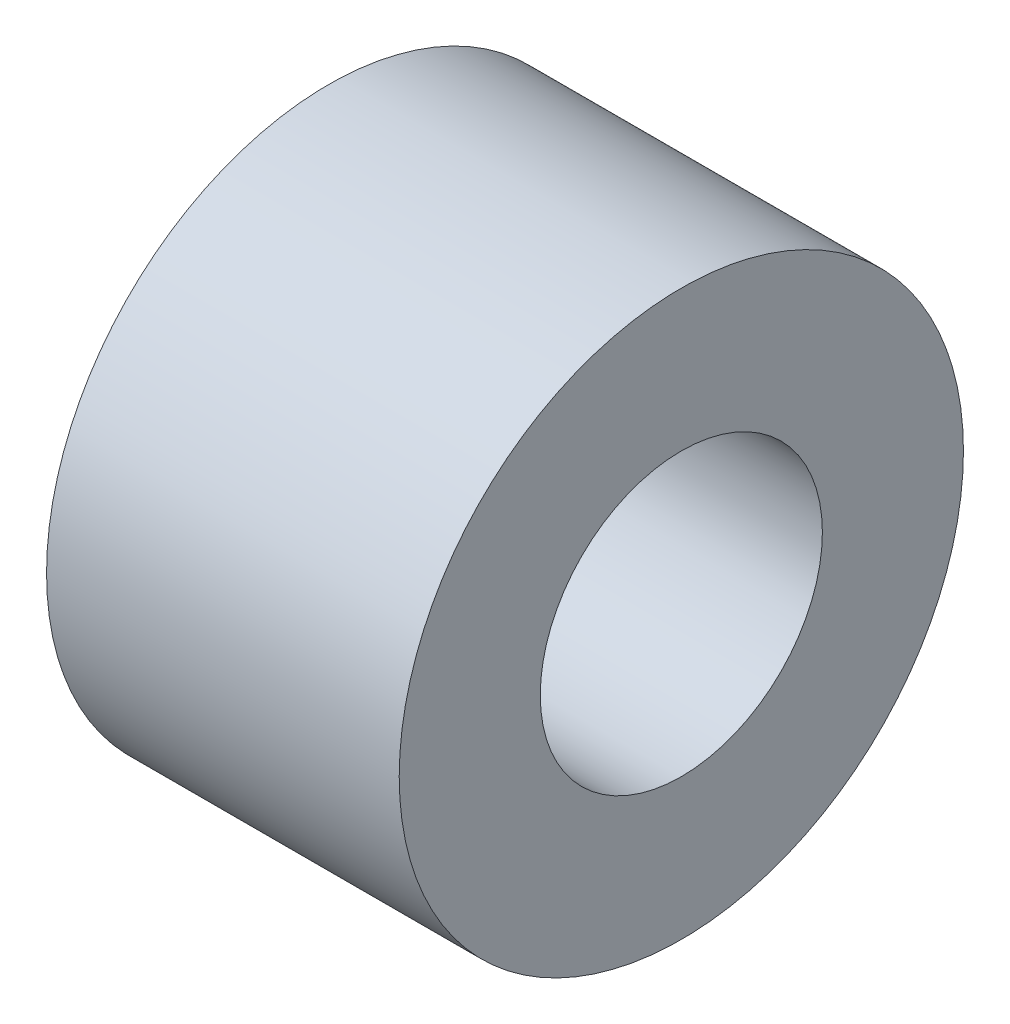
ISO-10303-21;
HEADER;
FILE_DESCRIPTION(('STEP AP214'),'2;1');
FILE_NAME('part.step','',(''),(''),'','','');
FILE_SCHEMA(('AUTOMOTIVE_DESIGN { 1 0 10303 214 1 1 1 1 }'));
ENDSEC;
DATA;
#1=APPLICATION_CONTEXT('core data for automotive mechanical design processes');
#2=APPLICATION_PROTOCOL_DEFINITION('international standard','automotive_design',2000,#1);
#3=PRODUCT_CONTEXT('',#1,'mechanical');
#4=PRODUCT('Part','Part','',(#3));
#5=PRODUCT_RELATED_PRODUCT_CATEGORY('part','',(#4));
#6=PRODUCT_DEFINITION_FORMATION('','',#4);
#7=PRODUCT_DEFINITION_CONTEXT('part definition',#1,'design');
#8=PRODUCT_DEFINITION('design','',#6,#7);
#9=PRODUCT_DEFINITION_SHAPE('','',#8);
#10=(LENGTH_UNIT() NAMED_UNIT(*) SI_UNIT(.MILLI.,.METRE.));
#11=(NAMED_UNIT(*) PLANE_ANGLE_UNIT() SI_UNIT($,.RADIAN.));
#12=(NAMED_UNIT(*) SI_UNIT($,.STERADIAN.) SOLID_ANGLE_UNIT());
#13=UNCERTAINTY_MEASURE_WITH_UNIT(LENGTH_MEASURE(1.E-05),#10,'distance_accuracy_value','');
#14=(GEOMETRIC_REPRESENTATION_CONTEXT(3) GLOBAL_UNCERTAINTY_ASSIGNED_CONTEXT((#13)) GLOBAL_UNIT_ASSIGNED_CONTEXT((#10,
#11,#12)) REPRESENTATION_CONTEXT('',''));
#15=CARTESIAN_POINT('',(0.,0.,0.));
#16=DIRECTION('',(0.,0.,1.));
#17=DIRECTION('',(1.,0.,0.));
#18=AXIS2_PLACEMENT_3D('',#15,#16,#17);
#19=CARTESIAN_POINT('',(127.,0.,0.));
#20=DIRECTION('',(1.,0.,0.));
#21=DIRECTION('',(0.,0.,-1.));
#22=AXIS2_PLACEMENT_3D('',#19,#20,#21);
#23=PLANE('',#22);
#24=CARTESIAN_POINT('',(127.,0.,0.));
#25=DIRECTION('',(1.,0.,0.));
#26=DIRECTION('',(0.,0.,-1.));
#27=AXIS2_PLACEMENT_3D('',#24,#25,#26);
#28=CIRCLE('',#27,203.2);
#29=CARTESIAN_POINT('',(127.,0.,-203.2));
#30=VERTEX_POINT('',#29);
#31=EDGE_CURVE('E10',#30,#30,#28,.T.);
#32=ORIENTED_EDGE('',*,*,#31,.T.);
#33=EDGE_LOOP('',(#32));
#34=FACE_BOUND('',#33,.T.);
#35=CARTESIAN_POINT('',(127.,0.,0.));
#36=DIRECTION('',(1.,0.,0.));
#37=DIRECTION('',(0.,0.,-1.));
#38=AXIS2_PLACEMENT_3D('',#35,#36,#37);
#39=CIRCLE('',#38,101.6);
#40=CARTESIAN_POINT('',(127.,0.,-101.6));
#41=VERTEX_POINT('',#40);
#42=EDGE_CURVE('E41',#41,#41,#39,.T.);
#43=ORIENTED_EDGE('',*,*,#42,.F.);
#44=EDGE_LOOP('',(#43));
#45=FACE_BOUND('',#44,.T.);
#46=ADVANCED_FACE('F30',(#34,#45),#23,.T.);
#47=CARTESIAN_POINT('',(-127.,0.,0.));
#48=DIRECTION('',(1.,0.,0.));
#49=DIRECTION('',(0.,0.,-1.));
#50=AXIS2_PLACEMENT_3D('',#47,#48,#49);
#51=PLANE('',#50);
#52=CARTESIAN_POINT('',(-127.,0.,0.));
#53=DIRECTION('',(1.,0.,0.));
#54=DIRECTION('',(0.,0.,-1.));
#55=AXIS2_PLACEMENT_3D('',#52,#53,#54);
#56=CIRCLE('',#55,203.2);
#57=CARTESIAN_POINT('',(-127.,0.,-203.2));
#58=VERTEX_POINT('',#57);
#59=EDGE_CURVE('E34',#58,#58,#56,.T.);
#60=ORIENTED_EDGE('',*,*,#59,.F.);
#61=EDGE_LOOP('',(#60));
#62=FACE_BOUND('',#61,.T.);
#63=CARTESIAN_POINT('',(-127.,0.,0.));
#64=DIRECTION('',(1.,0.,0.));
#65=DIRECTION('',(0.,0.,-1.));
#66=AXIS2_PLACEMENT_3D('',#63,#64,#65);
#67=CIRCLE('',#66,101.6);
#68=CARTESIAN_POINT('',(-127.,0.,-101.6));
#69=VERTEX_POINT('',#68);
#70=EDGE_CURVE('E43',#69,#69,#67,.T.);
#71=ORIENTED_EDGE('',*,*,#70,.T.);
#72=EDGE_LOOP('',(#71));
#73=FACE_BOUND('',#72,.T.);
#74=ADVANCED_FACE('F53',(#62,#73),#51,.F.);
#75=CARTESIAN_POINT('',(127.,0.,0.));
#76=DIRECTION('',(-1.,0.,0.));
#77=DIRECTION('',(0.,0.,1.));
#78=AXIS2_PLACEMENT_3D('',#75,#76,#77);
#79=CYLINDRICAL_SURFACE('',#78,203.2);
#80=ORIENTED_EDGE('',*,*,#31,.F.);
#81=EDGE_LOOP('',(#80));
#82=FACE_BOUND('',#81,.T.);
#83=ORIENTED_EDGE('',*,*,#59,.T.);
#84=EDGE_LOOP('',(#83));
#85=FACE_BOUND('',#84,.T.);
#86=ADVANCED_FACE('F32',(#82,#85),#79,.T.);
#87=CARTESIAN_POINT('',(127.,0.,0.));
#88=DIRECTION('',(-1.,0.,0.));
#89=DIRECTION('',(0.,0.,1.));
#90=AXIS2_PLACEMENT_3D('',#87,#88,#89);
#91=CYLINDRICAL_SURFACE('',#90,101.6);
#92=ORIENTED_EDGE('',*,*,#42,.T.);
#93=EDGE_LOOP('',(#92));
#94=FACE_BOUND('',#93,.T.);
#95=ORIENTED_EDGE('',*,*,#70,.F.);
#96=EDGE_LOOP('',(#95));
#97=FACE_BOUND('',#96,.T.);
#98=ADVANCED_FACE('F49',(#94,#97),#91,.F.);
#99=CLOSED_SHELL('',(#46,#74,#86,#98));
#100=MANIFOLD_SOLID_BREP('B2',#99);
#101=ADVANCED_BREP_SHAPE_REPRESENTATION('',(#18,#100),#14);
#102=SHAPE_DEFINITION_REPRESENTATION(#9,#101);
ENDSEC;
END-ISO-10303-21;
